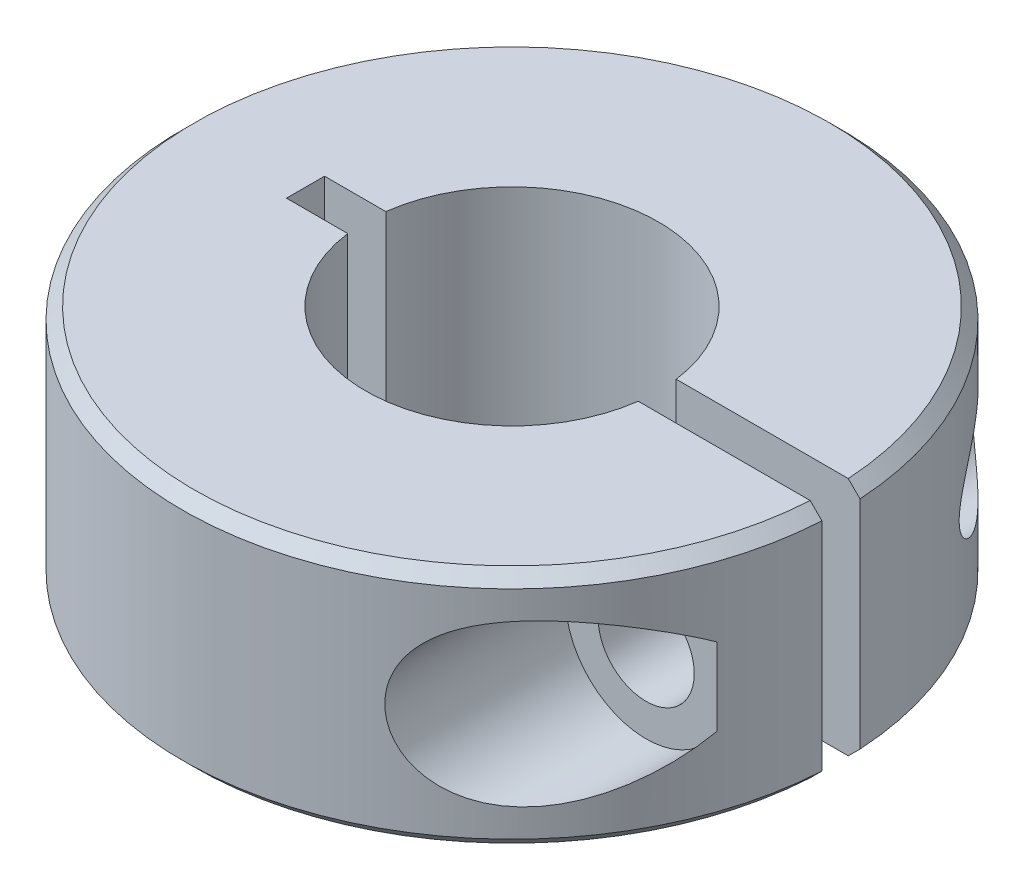
ISO-10303-21;
HEADER;
FILE_DESCRIPTION(('STEP AP214'),'2;1');
FILE_NAME('part.step','',(''),(''),'','','');
FILE_SCHEMA(('AUTOMOTIVE_DESIGN { 1 0 10303 214 1 1 1 1 }'));
ENDSEC;
DATA;
#1=APPLICATION_CONTEXT('core data for automotive mechanical design processes');
#2=APPLICATION_PROTOCOL_DEFINITION('international standard','automotive_design',2000,#1);
#3=PRODUCT_CONTEXT('',#1,'mechanical');
#4=PRODUCT('Part','Part','',(#3));
#5=PRODUCT_RELATED_PRODUCT_CATEGORY('part','',(#4));
#6=PRODUCT_DEFINITION_FORMATION('','',#4);
#7=PRODUCT_DEFINITION_CONTEXT('part definition',#1,'design');
#8=PRODUCT_DEFINITION('design','',#6,#7);
#9=PRODUCT_DEFINITION_SHAPE('','',#8);
#10=(LENGTH_UNIT() NAMED_UNIT(*) SI_UNIT(.MILLI.,.METRE.));
#11=(NAMED_UNIT(*) PLANE_ANGLE_UNIT() SI_UNIT($,.RADIAN.));
#12=(NAMED_UNIT(*) SI_UNIT($,.STERADIAN.) SOLID_ANGLE_UNIT());
#13=UNCERTAINTY_MEASURE_WITH_UNIT(LENGTH_MEASURE(1.E-05),#10,'distance_accuracy_value','');
#14=(GEOMETRIC_REPRESENTATION_CONTEXT(3) GLOBAL_UNCERTAINTY_ASSIGNED_CONTEXT((#13)) GLOBAL_UNIT_ASSIGNED_CONTEXT((#10,
#11,#12)) REPRESENTATION_CONTEXT('',''));
#15=CARTESIAN_POINT('',(0.,0.,0.));
#16=DIRECTION('',(0.,0.,1.));
#17=DIRECTION('',(1.,0.,0.));
#18=AXIS2_PLACEMENT_3D('',#15,#16,#17);
#19=CARTESIAN_POINT('',(10.4536322863428,5.207,4.6355));
#20=DIRECTION('',(0.,0.,1.));
#21=DIRECTION('',(1.,0.,0.));
#22=AXIS2_PLACEMENT_3D('',#19,#20,#21);
#23=PLANE('',#22);
#24=DIRECTION('',(0.,-1.,0.));
#25=VECTOR('',#24,1.);
#26=CARTESIAN_POINT('',(13.5146141639338,10.414,4.6355));
#27=LINE('',#26,#25);
#28=CARTESIAN_POINT('',(13.5146141639338,6.88864984317763,4.6355));
#29=VERTEX_POINT('',#28);
#30=CARTESIAN_POINT('',(13.5146141639338,3.52535015682237,4.6355));
#31=VERTEX_POINT('',#30);
#32=EDGE_CURVE('E131',#29,#31,#27,.T.);
#33=ORIENTED_EDGE('',*,*,#32,.F.);
#34=CARTESIAN_POINT('',(10.4536322863428,5.207,4.6355));
#35=DIRECTION('',(0.,0.,1.));
#36=DIRECTION('',(1.,0.,0.));
#37=AXIS2_PLACEMENT_3D('',#34,#35,#36);
#38=CIRCLE('',#37,3.4925);
#39=EDGE_CURVE('E106',#29,#31,#38,.T.);
#40=ORIENTED_EDGE('',*,*,#39,.T.);
#41=EDGE_LOOP('',(#33,#40));
#42=FACE_BOUND('',#41,.T.);
#43=CARTESIAN_POINT('',(10.4536322863428,5.207,4.6355));
#44=DIRECTION('',(0.,0.,1.));
#45=DIRECTION('',(1.,0.,0.));
#46=AXIS2_PLACEMENT_3D('',#43,#44,#45);
#47=CIRCLE('',#46,2.0828);
#48=CARTESIAN_POINT('',(12.5364322863428,5.207,4.6355));
#49=VERTEX_POINT('',#48);
#50=EDGE_CURVE('E216',#49,#49,#47,.F.);
#51=ORIENTED_EDGE('',*,*,#50,.T.);
#52=EDGE_LOOP('',(#51));
#53=FACE_BOUND('',#52,.T.);
#54=ADVANCED_FACE('F16',(#42,#53),#23,.T.);
#55=CARTESIAN_POINT('',(10.4536322863428,5.207,4.6355));
#56=DIRECTION('',(0.,0.,1.));
#57=DIRECTION('',(1.,0.,0.));
#58=AXIS2_PLACEMENT_3D('',#55,#56,#57);
#59=CYLINDRICAL_SURFACE('',#58,3.4925);
#60=CARTESIAN_POINT('',(13.5146141639338,3.52535015682237,4.6355));
#61=CARTESIAN_POINT('',(13.4734657813785,3.45053219058758,4.75549351409186));
#62=CARTESIAN_POINT('',(13.4302268169956,3.37825171797123,4.87632226470497));
#63=CARTESIAN_POINT('',(13.3395890388117,3.23828630950166,5.11905587048309));
#64=CARTESIAN_POINT('',(13.2921907963967,3.17060074467606,5.24096057577444));
#65=CARTESIAN_POINT('',(13.1931964607886,3.0392617366335,5.48540352856889));
#66=CARTESIAN_POINT('',(13.1415963377628,2.97561227080964,5.60794227615091));
#67=CARTESIAN_POINT('',(13.0342211969043,2.85225921923072,5.85317465900483));
#68=CARTESIAN_POINT('',(12.9784459805432,2.7925558213684,5.975868301369));
#69=CARTESIAN_POINT('',(12.8035198465617,2.61799180579304,6.3464707029259));
#70=CARTESIAN_POINT('',(12.6778580339151,2.50912338644716,6.59419094317968));
#71=CARTESIAN_POINT('',(12.4091250243239,2.30843324196439,7.08696054488827));
#72=CARTESIAN_POINT('',(12.2660619517979,2.21660361183348,7.33201109500072));
#73=CARTESIAN_POINT('',(12.0052477166712,2.07564708698722,7.74912543976716));
#74=CARTESIAN_POINT('',(11.8917557906811,2.02178401285684,7.92226024176632));
#75=CARTESIAN_POINT('',(11.6557500270132,1.92542766697286,8.26556218030146));
#76=CARTESIAN_POINT('',(11.533236381716,1.8829341528624,8.43572938002342));
#77=CARTESIAN_POINT('',(11.2798270313037,1.81108400396178,8.77167493314818));
#78=CARTESIAN_POINT('',(11.1489608381485,1.78168375770536,8.93746609965116));
#79=CARTESIAN_POINT('',(10.8789571050037,1.73779950539819,9.26422217701491));
#80=CARTESIAN_POINT('',(10.7398223363136,1.72331053117014,9.42518867800495));
#81=CARTESIAN_POINT('',(10.4950334102033,1.71325543423184,9.69587871504203));
#82=CARTESIAN_POINT('',(10.3911879203858,1.71346171942844,9.80708826330747));
#83=CARTESIAN_POINT('',(10.1802354802179,1.72361663070433,10.025893466123));
#84=CARTESIAN_POINT('',(10.0731293800066,1.73356273804458,10.1334900475539));
#85=CARTESIAN_POINT('',(9.85638583343249,1.76420771090556,10.3444260668589));
#86=CARTESIAN_POINT('',(9.74675006801209,1.78489962197864,10.4477682114819));
#87=CARTESIAN_POINT('',(9.52588108770916,1.83806226956346,10.649537619316));
#88=CARTESIAN_POINT('',(9.41464827420099,1.87053009461799,10.7479660905383));
#89=CARTESIAN_POINT('',(9.12987537167168,1.96989084403904,10.9922670682501));
#90=CARTESIAN_POINT('',(8.95596905107547,2.04589004994249,11.1342012865989));
#91=CARTESIAN_POINT('',(8.61362008254316,2.2321383236134,11.4011079576924));
#92=CARTESIAN_POINT('',(8.44517149773397,2.34234869391756,11.5260993467201));
#93=CARTESIAN_POINT('',(8.14767599480001,2.57828064385485,11.737799690831));
#94=CARTESIAN_POINT('',(8.01661550847026,2.69877572674256,11.8274363669922));
#95=CARTESIAN_POINT('',(7.83192228611212,2.89779565642393,11.949860104194));
#96=CARTESIAN_POINT('',(7.77231760901356,2.96721581323779,11.9886769770841));
#97=CARTESIAN_POINT('',(7.65782156389897,3.1118882979624,12.0621323672482));
#98=CARTESIAN_POINT('',(7.60292823971712,3.1871381804217,12.0967726211072));
#99=CARTESIAN_POINT('',(7.49830093292872,3.34354130070497,12.1619062932599));
#100=CARTESIAN_POINT('',(7.44859817410285,3.42472577073414,12.1923749239681));
#101=CARTESIAN_POINT('',(7.35545677608882,3.59206106144915,12.248790801792));
#102=CARTESIAN_POINT('',(7.31201529904221,3.67820960728044,12.2747400983654));
#103=CARTESIAN_POINT('',(7.23203185111771,3.85487230403631,12.3220344359941));
#104=CARTESIAN_POINT('',(7.1954901412556,3.9453866199539,12.3433793028699));
#105=CARTESIAN_POINT('',(7.12988497012144,4.13003344351378,12.3813907247671));
#106=CARTESIAN_POINT('',(7.10082078424802,4.22416559955636,12.3980577331056));
#107=CARTESIAN_POINT('',(7.05304880785853,4.40602638859494,12.4252903177215));
#108=CARTESIAN_POINT('',(7.03361378670217,4.49350010114398,12.4362885582186));
#109=CARTESIAN_POINT('',(7.00147942471002,4.67010564802743,12.4544081686503));
#110=CARTESIAN_POINT('',(6.98878242413213,4.75923804734818,12.46152819162));
#111=CARTESIAN_POINT('',(6.97031479326768,4.93838536632259,12.471867685147));
#112=CARTESIAN_POINT('',(6.96453936638425,5.02839963118782,12.4750898568995));
#113=CARTESIAN_POINT('',(6.95996641036833,5.20866928056879,12.4776407324856));
#114=CARTESIAN_POINT('',(6.96117140906697,5.29892474060111,12.4769680258616));
#115=CARTESIAN_POINT('',(6.97485547868691,5.56083018433861,12.4693320703588));
#116=CARTESIAN_POINT('',(6.99657860081275,5.73196791782358,12.4572112567843));
#117=CARTESIAN_POINT('',(7.0644773249253,6.0675472042355,12.4188280452145));
#118=CARTESIAN_POINT('',(7.11065080142872,6.23198933787686,12.3925668764449));
#119=CARTESIAN_POINT('',(7.22552964313838,6.55078228504552,12.3259394518561));
#120=CARTESIAN_POINT('',(7.29435329763117,6.70507490556951,12.2854990718149));
#121=CARTESIAN_POINT('',(7.45125033525368,6.99893413241851,12.1909753181492));
#122=CARTESIAN_POINT('',(7.53932609811345,7.13849891508802,12.1368902577947));
#123=CARTESIAN_POINT('',(7.73587713959669,7.40710864273126,12.0126194917526));
#124=CARTESIAN_POINT('',(7.84517521880329,7.53522876611185,11.9417426282886));
#125=CARTESIAN_POINT('',(8.07609541606501,7.77061030400829,11.7868006563529));
#126=CARTESIAN_POINT('',(8.19772180825944,7.87786444655456,11.7027309684464));
#127=CARTESIAN_POINT('',(8.46291690870689,8.08200903377094,11.5126526100139));
#128=CARTESIAN_POINT('',(8.60741421061004,8.17637242755249,11.4052394877601));
#129=CARTESIAN_POINT('',(8.90073714356776,8.33977919115744,11.1778351740133));
#130=CARTESIAN_POINT('',(9.04956534044457,8.40880720738168,11.0578364118865));
#131=CARTESIAN_POINT('',(9.31163071284513,8.50974549148681,10.8373506674988));
#132=CARTESIAN_POINT('',(9.42487253616357,8.54658399722366,10.7390552352876));
#133=CARTESIAN_POINT('',(9.65005912660641,8.60780034714005,10.5371663994815));
#134=CARTESIAN_POINT('',(9.76200335279959,8.63217316525478,10.433570877422));
#135=CARTESIAN_POINT('',(9.98362201141289,8.66955645983414,10.2217166794503));
#136=CARTESIAN_POINT('',(10.093292870003,8.68255020152385,10.1134513803896));
#137=CARTESIAN_POINT('',(10.3094354987476,8.69820429545875,9.89303007243206));
#138=CARTESIAN_POINT('',(10.4159063099263,8.7008615801624,9.78087291851424));
#139=CARTESIAN_POINT('',(10.6698032622963,8.69600237338331,9.50455735800215));
#140=CARTESIAN_POINT('',(10.815270275933,8.68364864047623,9.33867401080148));
#141=CARTESIAN_POINT('',(11.0974341583399,8.64260972440966,9.00155525234797));
#142=CARTESIAN_POINT('',(11.2341274201624,8.61391787178743,8.83031768241778));
#143=CARTESIAN_POINT('',(11.4986266568716,8.54232309834144,8.48304471939207));
#144=CARTESIAN_POINT('',(11.6263992430819,8.49936992483025,8.30699440987783));
#145=CARTESIAN_POINT('',(11.8722598647629,8.4011468117412,7.95165390832879));
#146=CARTESIAN_POINT('',(11.9903479213965,8.34587689907917,7.77236372337488));
#147=CARTESIAN_POINT('',(12.2568210675834,8.20305071244246,7.34752650723967));
#148=CARTESIAN_POINT('',(12.4011658342254,8.1109870683365,7.10095510570883));
#149=CARTESIAN_POINT('',(12.6722305711475,7.9095778855415,6.60508070707717));
#150=CARTESIAN_POINT('',(12.798942523566,7.8002245329705,6.35577652256779));
#151=CARTESIAN_POINT('',(12.9751973544264,7.62485137379911,5.98293566748013));
#152=CARTESIAN_POINT('',(13.031342202396,7.56490682767397,5.85959832088662));
#153=CARTESIAN_POINT('',(13.1394123453171,7.44103157637116,5.61307492527278));
#154=CARTESIAN_POINT('',(13.1913378451019,7.3771010649635,5.48988886919416));
#155=CARTESIAN_POINT('',(13.290938432216,7.24516098146888,5.24415362352607));
#156=CARTESIAN_POINT('',(13.3386176276605,7.17715546074122,5.12160392882291));
#157=CARTESIAN_POINT('',(13.4297737880896,7.03650466998009,4.8775883402019));
#158=CARTESIAN_POINT('',(13.4732501710035,6.96385875958078,4.75612259851508));
#159=CARTESIAN_POINT('',(13.5146141639338,6.88864984317763,4.6355));
#160=B_SPLINE_CURVE_WITH_KNOTS('',3,(#60,#61,#62,#63,#64,#65,#66,#67,#68,#69,#70,#71,#72,#73,
#74,#75,#76,#77,#78,#79,#80,#81,#82,#83,#84,#85,#86,#87,#88,#89,#90,#91,#92,#93,#94,#95,#96,#97,
#98,#99,#100,#101,#102,#103,#104,#105,#106,#107,#108,#109,#110,#111,#112,#113,#114,#115,#116,
#117,#118,#119,#120,#121,#122,#123,#124,#125,#126,#127,#128,#129,#130,#131,#132,#133,#134,#135,
#136,#137,#138,#139,#140,#141,#142,#143,#144,#145,#146,#147,#148,#149,#150,#151,#152,#153,#154,
#155,#156,#157,#158,#159),.UNSPECIFIED.,.F.,.F.,(4,2,2,2,2,2,2,2,2,2,2,2,2,2,2,2,2,2,2,2,2,2,2,
2,2,2,2,2,2,2,2,2,2,2,2,2,2,2,2,2,2,2,2,2,2,2,2,2,2,4),(0.,0.441744010800502,0.883427431187499,
1.32553955498952,1.76767271489679,2.66168998310212,3.55529143718905,4.19657085490573,
4.83783660183374,5.47695012656619,6.11585064074666,6.57197774202862,7.02798691899797,
7.48370134396361,7.93930317557769,8.64740459762837,9.35470796180666,9.94991443244466,
10.2477752709386,10.5455118324503,10.8449471417357,11.1442463055178,11.4435567894148,
11.7428382580197,12.0133339889288,12.2839236073735,12.5543256006821,12.8248255211573,
13.3409593665076,13.8570483514111,14.3758765248121,14.8947688662449,15.4406520416796,
15.9867251225178,16.5942899710242,17.202222406901,17.6648523064335,18.127668587861,
18.5911643780392,19.054797708979,19.7167205885678,20.3789138687953,21.0434657349404,
21.7080161488521,22.6074073385579,23.5072061656266,23.9516581501891,24.3960885453975,
24.8400841936527,25.2841412454728),.UNSPECIFIED.);
#161=EDGE_CURVE('E100',#31,#29,#160,.T.);
#162=ORIENTED_EDGE('',*,*,#161,.F.);
#163=ORIENTED_EDGE('',*,*,#39,.F.);
#164=EDGE_LOOP('',(#162,#163));
#165=FACE_BOUND('',#164,.T.);
#166=ADVANCED_FACE('F198',(#165),#59,.F.);
#167=CARTESIAN_POINT('',(0.,9.906,0.));
#168=DIRECTION('',(0.,-1.,0.));
#169=DIRECTION('',(0.,0.,-1.));
#170=AXIS2_PLACEMENT_3D('',#167,#168,#169);
#171=CONICAL_SURFACE('',#170,14.2875,0.785398163397447);
#172=CARTESIAN_POINT('',(0.,9.906,0.));
#173=DIRECTION('',(0.,-1.,0.));
#174=DIRECTION('',(0.,0.,-1.));
#175=AXIS2_PLACEMENT_3D('',#172,#173,#174);
#176=CIRCLE('',#175,14.2875);
#177=CARTESIAN_POINT('',(14.2636322863428,9.906,0.825500000000003));
#178=VERTEX_POINT('',#177);
#179=CARTESIAN_POINT('',(14.2636322863428,9.906,-0.825499999999997));
#180=VERTEX_POINT('',#179);
#181=EDGE_CURVE('E91',#178,#180,#176,.T.);
#182=ORIENTED_EDGE('',*,*,#181,.F.);
#183=CARTESIAN_POINT('',(14.2636322863428,9.906,0.825500000000003));
#184=CARTESIAN_POINT('',(14.1788213692304,9.99066933262399,0.825500000000003));
#185=CARTESIAN_POINT('',(14.0940091214481,10.0753373322691,0.825500000000003));
#186=CARTESIAN_POINT('',(13.9243819645429,10.2446706656025,0.825500000000003));
#187=CARTESIAN_POINT('',(13.8395670554201,10.3293359992907,0.825500000000003));
#188=CARTESIAN_POINT('',(13.7547508156273,10.414,0.825500000000003));
#189=B_SPLINE_CURVE_WITH_KNOTS('',3,(#183,#184,#185,#186,#187,#188),.UNSPECIFIED.,.F.,.F.,(4,2,
4),(0.,0.359522026919291,0.719044053841794),.UNSPECIFIED.);
#190=CARTESIAN_POINT('',(13.7547508156273,10.414,0.825500000000003));
#191=VERTEX_POINT('',#190);
#192=EDGE_CURVE('E138',#178,#191,#189,.T.);
#193=ORIENTED_EDGE('',*,*,#192,.T.);
#194=CARTESIAN_POINT('',(0.,10.414,0.));
#195=DIRECTION('',(0.,-1.,0.));
#196=DIRECTION('',(0.,0.,-1.));
#197=AXIS2_PLACEMENT_3D('',#194,#195,#196);
#198=CIRCLE('',#197,13.7795);
#199=CARTESIAN_POINT('',(13.7547508156273,10.414,-0.825499999999997));
#200=VERTEX_POINT('',#199);
#201=EDGE_CURVE('E84',#200,#191,#198,.F.);
#202=ORIENTED_EDGE('',*,*,#201,.F.);
#203=CARTESIAN_POINT('',(13.7547508156273,10.414,-0.825499999999997));
#204=CARTESIAN_POINT('',(13.8395670554201,10.3293359992907,-0.825499999999997));
#205=CARTESIAN_POINT('',(13.9243819645429,10.2446706656025,-0.825499999999997));
#206=CARTESIAN_POINT('',(14.0940091214481,10.0753373322691,-0.825499999999997));
#207=CARTESIAN_POINT('',(14.1788213692304,9.99066933262399,-0.825499999999997));
#208=CARTESIAN_POINT('',(14.2636322863428,9.906,-0.825499999999997));
#209=B_SPLINE_CURVE_WITH_KNOTS('',3,(#203,#204,#205,#206,#207,#208),.UNSPECIFIED.,.F.,.F.,(4,2,
4),(0.,0.359522026922503,0.719044053841793),.UNSPECIFIED.);
#210=EDGE_CURVE('E19',#200,#180,#209,.T.);
#211=ORIENTED_EDGE('',*,*,#210,.T.);
#212=EDGE_LOOP('',(#182,#193,#202,#211));
#213=FACE_BOUND('',#212,.T.);
#214=ADVANCED_FACE('F102',(#213),#171,.T.);
#215=CARTESIAN_POINT('',(-8.9535,0.,-0.825499999999997));
#216=DIRECTION('',(-1.,0.,0.));
#217=DIRECTION('',(0.,0.,1.));
#218=AXIS2_PLACEMENT_3D('',#215,#216,#217);
#219=PLANE('',#218);
#220=DIRECTION('',(0.,1.,0.));
#221=VECTOR('',#220,1.);
#222=CARTESIAN_POINT('',(-8.9535,0.,0.825500000000003));
#223=LINE('',#222,#221);
#224=CARTESIAN_POINT('',(-8.9535,10.414,0.825500000000003));
#225=VERTEX_POINT('',#224);
#226=CARTESIAN_POINT('',(-8.9535,0.,0.825500000000003));
#227=VERTEX_POINT('',#226);
#228=EDGE_CURVE('E144',#225,#227,#223,.F.);
#229=ORIENTED_EDGE('',*,*,#228,.T.);
#230=DIRECTION('',(0.,0.,1.));
#231=VECTOR('',#230,1.);
#232=CARTESIAN_POINT('',(-8.9535,0.,-0.825499999999997));
#233=LINE('',#232,#231);
#234=CARTESIAN_POINT('',(-8.9535,0.,-0.825499999999997));
#235=VERTEX_POINT('',#234);
#236=EDGE_CURVE('E134',#235,#227,#233,.T.);
#237=ORIENTED_EDGE('',*,*,#236,.F.);
#238=DIRECTION('',(0.,1.,0.));
#239=VECTOR('',#238,1.);
#240=CARTESIAN_POINT('',(-8.9535,0.,-0.825499999999997));
#241=LINE('',#240,#239);
#242=CARTESIAN_POINT('',(-8.9535,10.414,-0.825499999999997));
#243=VERTEX_POINT('',#242);
#244=EDGE_CURVE('E125',#235,#243,#241,.T.);
#245=ORIENTED_EDGE('',*,*,#244,.T.);
#246=DIRECTION('',(0.,0.,1.));
#247=VECTOR('',#246,1.);
#248=CARTESIAN_POINT('',(-8.9535,10.414,0.));
#249=LINE('',#248,#247);
#250=EDGE_CURVE('E128',#225,#243,#249,.F.);
#251=ORIENTED_EDGE('',*,*,#250,.F.);
#252=EDGE_LOOP('',(#229,#237,#245,#251));
#253=FACE_BOUND('',#252,.T.);
#254=ADVANCED_FACE('F226',(#253),#219,.F.);
#255=CARTESIAN_POINT('',(10.4536322863428,5.207,-23.8125));
#256=DIRECTION('',(0.,0.,1.));
#257=DIRECTION('',(1.,0.,0.));
#258=AXIS2_PLACEMENT_3D('',#255,#256,#257);
#259=CYLINDRICAL_SURFACE('',#258,2.0828);
#260=CARTESIAN_POINT('',(10.4536322863428,5.207,-0.825499999999996));
#261=DIRECTION('',(0.,0.,1.));
#262=DIRECTION('',(1.,0.,0.));
#263=AXIS2_PLACEMENT_3D('',#260,#261,#262);
#264=CIRCLE('',#263,2.0828);
#265=CARTESIAN_POINT('',(12.5364322863428,5.207,-0.825499999999996));
#266=VERTEX_POINT('',#265);
#267=EDGE_CURVE('E183',#266,#266,#264,.T.);
#268=ORIENTED_EDGE('',*,*,#267,.T.);
#269=EDGE_LOOP('',(#268));
#270=FACE_BOUND('',#269,.T.);
#271=CARTESIAN_POINT('',(8.37083228634278,5.207,-11.5785069453674));
#272=CARTESIAN_POINT('',(8.37083992321464,5.10722026734939,-11.5785027948659));
#273=CARTESIAN_POINT('',(8.37805006458452,5.00736084112323,-11.5732993601378));
#274=CARTESIAN_POINT('',(8.40646558473121,4.81068216838004,-11.5526743356489));
#275=CARTESIAN_POINT('',(8.42768758095025,4.71386667483173,-11.5372406131321));
#276=CARTESIAN_POINT('',(8.48275190200082,4.52641586181302,-11.4968137757952));
#277=CARTESIAN_POINT('',(8.51654958261779,4.43576000592412,-11.4718544692471));
#278=CARTESIAN_POINT('',(8.59493926629222,4.26234080868377,-11.4132405573571));
#279=CARTESIAN_POINT('',(8.63953100023651,4.17957727063578,-11.3795861687963));
#280=CARTESIAN_POINT('',(8.74003708637884,4.0191112745853,-11.3025928911207));
#281=CARTESIAN_POINT('',(8.79642659623595,3.94191020202831,-11.2588349645784));
#282=CARTESIAN_POINT('',(8.91646839229515,3.79847308306983,-11.1640099965132));
#283=CARTESIAN_POINT('',(8.98012460276749,3.73224300915826,-11.1129390018569));
#284=CARTESIAN_POINT('',(9.14219176360373,3.58371019437211,-10.9803557395842));
#285=CARTESIAN_POINT('',(9.24340867225347,3.50747643131859,-10.8954477617019));
#286=CARTESIAN_POINT('',(9.45118364029093,3.37717447081319,-10.7157262865252));
#287=CARTESIAN_POINT('',(9.55775193783372,3.32315073066023,-10.6208933939341));
#288=CARTESIAN_POINT('',(9.80900359066056,3.22036769197991,-10.3900990613777));
#289=CARTESIAN_POINT('',(9.95425766364662,3.17972763815165,-10.2511636774331));
#290=CARTESIAN_POINT('',(10.2413018572967,3.12992108248867,-9.964424395616));
#291=CARTESIAN_POINT('',(10.3830868013125,3.12079906929713,-9.81660826126878));
#292=CARTESIAN_POINT('',(10.6117214781662,3.12824377830954,-9.56775581345591));
#293=CARTESIAN_POINT('',(10.7006013277489,3.13701266098545,-9.46823418878775));
#294=CARTESIAN_POINT('',(10.8748445868078,3.16532623213195,-9.26758067403906));
#295=CARTESIAN_POINT('',(10.9602066808226,3.18487491309638,-9.16644820083656));
#296=CARTESIAN_POINT('',(11.1270411179947,3.23414536599073,-8.96319905868907));
#297=CARTESIAN_POINT('',(11.2085069853206,3.26388344666178,-8.86108106858953));
#298=CARTESIAN_POINT('',(11.3670271228449,3.33316749447469,-8.65679222526301));
#299=CARTESIAN_POINT('',(11.4440827813216,3.37271035406197,-8.55462139900114));
#300=CARTESIAN_POINT('',(11.5780551317187,3.45243804331258,-8.37205761799897));
#301=CARTESIAN_POINT('',(11.635850493131,3.49081255178422,-8.29151418438075));
#302=CARTESIAN_POINT('',(11.7482380036105,3.5739238558317,-8.13148889607971));
#303=CARTESIAN_POINT('',(11.8028307594663,3.61865944065713,-8.05200684251874));
#304=CARTESIAN_POINT('',(11.9083422123707,3.71470408200634,-7.8951214707489));
#305=CARTESIAN_POINT('',(11.9592740965991,3.76598748349517,-7.8177113946988));
#306=CARTESIAN_POINT('',(12.0572504624474,3.87587873393593,-7.6657369661134));
#307=CARTESIAN_POINT('',(12.1042980035919,3.93448072514727,-7.59117039927348));
#308=CARTESIAN_POINT('',(12.1881368341907,4.05198073100936,-7.45570147332415));
#309=CARTESIAN_POINT('',(12.2254697261338,4.10987756144764,-7.39427291646235));
#310=CARTESIAN_POINT('',(12.2960479357775,4.23303625440596,-7.27630296011884));
#311=CARTESIAN_POINT('',(12.3292867252746,4.29830956924309,-7.21976940747026));
#312=CARTESIAN_POINT('',(12.3908316008589,4.43808173002392,-7.11363128102298));
#313=CARTESIAN_POINT('',(12.4190671475271,4.51269050959131,-7.06412749289363));
#314=CARTESIAN_POINT('',(12.4679697322498,4.67101022730007,-6.97745433589816));
#315=CARTESIAN_POINT('',(12.4886668850158,4.75468317659136,-6.94023594593323));
#316=CARTESIAN_POINT('',(12.5146204200119,4.90056994888516,-6.8932868488459));
#317=CARTESIAN_POINT('',(12.5227241026694,4.96063855362414,-6.87852885881559));
#318=CARTESIAN_POINT('',(12.5336262772715,5.08280731285208,-6.85864445375517));
#319=CARTESIAN_POINT('',(12.5364319085039,5.14490461857504,-6.85350507742975));
#320=CARTESIAN_POINT('',(12.5364326599302,5.26839667674135,-6.85350361689546));
#321=CARTESIAN_POINT('',(12.533690555046,5.32979147224593,-6.85852654205984));
#322=CARTESIAN_POINT('',(12.5230277189178,5.4506200035854,-6.8779757174078));
#323=CARTESIAN_POINT('',(12.5151006786578,5.51005125751747,-6.89241342340719));
#324=CARTESIAN_POINT('',(12.4920698529185,5.64099797813774,-6.93408551433065));
#325=CARTESIAN_POINT('',(12.4756147527584,5.71150156887528,-6.96370776809931));
#326=CARTESIAN_POINT('',(12.437162374589,5.84621720449739,-7.03215450724412));
#327=CARTESIAN_POINT('',(12.4151529634007,5.9104150425669,-7.07099912737925));
#328=CARTESIAN_POINT('',(12.3512323662783,6.0724253630074,-7.18234123733796));
#329=CARTESIAN_POINT('',(12.3056802502509,6.16498526278457,-7.26030849854926));
#330=CARTESIAN_POINT('',(12.2065634585214,6.33620156183093,-7.42575747975777));
#331=CARTESIAN_POINT('',(12.1529759664175,6.41481693133752,-7.51326609279021));
#332=CARTESIAN_POINT('',(12.0454410060845,6.55273682418439,-7.68434421980933));
#333=CARTESIAN_POINT('',(11.9921081890788,6.61319875346168,-7.76737986687158));
#334=CARTESIAN_POINT('',(11.8810664656063,6.72579710113708,-7.93619160341991));
#335=CARTESIAN_POINT('',(11.8233543506295,6.77792732670578,-8.02196967500298));
#336=CARTESIAN_POINT('',(11.7039601891243,6.87452315568082,-8.19518468593394));
#337=CARTESIAN_POINT('',(11.6422744612564,6.91898150707744,-8.28262310905603));
#338=CARTESIAN_POINT('',(11.5152691528827,7.00050955670839,-8.45830872766602));
#339=CARTESIAN_POINT('',(11.4499491017491,7.03757829516088,-8.54655602665787));
#340=CARTESIAN_POINT('',(11.3118632932747,7.10642118926707,-8.72858698858593));
#341=CARTESIAN_POINT('',(11.2388861359938,7.13773982408734,-8.82238284774289));
#342=CARTESIAN_POINT('',(11.089376714954,7.19199602675404,-9.00959132957644));
#343=CARTESIAN_POINT('',(11.012843884877,7.21493225432681,-9.10300388860784));
#344=CARTESIAN_POINT('',(10.8566337349726,7.2520135187338,-9.2887489829471));
#345=CARTESIAN_POINT('',(10.7769606645458,7.26617002948529,-9.38108277247634));
#346=CARTESIAN_POINT('',(10.614782170136,7.285160531911,-9.56420591618958));
#347=CARTESIAN_POINT('',(10.5322765998066,7.28999404115488,-9.65499519020977));
#348=CARTESIAN_POINT('',(10.3161923018508,7.28947725344657,-9.88667788192103));
#349=CARTESIAN_POINT('',(10.1808204740609,7.27656808177274,-10.0259981187358));
#350=CARTESIAN_POINT('',(9.90748057063845,7.2217338414323,-10.2961766290579));
#351=CARTESIAN_POINT('',(9.7695159601513,7.17984514512129,-10.4270452853221));
#352=CARTESIAN_POINT('',(9.52919525231592,7.07681715061922,-10.6464517900281));
#353=CARTESIAN_POINT('',(9.42623899335369,7.02270965433885,-10.7376115865962));
#354=CARTESIAN_POINT('',(9.22563273893706,6.89349345441485,-10.9104438950733));
#355=CARTESIAN_POINT('',(9.12797541395193,6.81841469102893,-10.9921296992304));
#356=CARTESIAN_POINT('',(8.96109360218021,6.66325790503897,-11.128375010651));
#357=CARTESIAN_POINT('',(8.89005264020706,6.58706053233099,-11.1851108583714));
#358=CARTESIAN_POINT('',(8.75772649441796,6.42077408829729,-11.2890190831904));
#359=CARTESIAN_POINT('',(8.69644148551136,6.33068476796715,-11.3361912888316));
#360=CARTESIAN_POINT('',(8.58666833901233,6.13702548324506,-11.4195715155544));
#361=CARTESIAN_POINT('',(8.53829481161265,6.03334622725096,-11.4556817349973));
#362=CARTESIAN_POINT('',(8.47855049896788,5.87067412498869,-11.4998889509456));
#363=CARTESIAN_POINT('',(8.46077622908864,5.81528123512851,-11.5129617961332));
#364=CARTESIAN_POINT('',(8.42980214257314,5.70255540623668,-11.5356604462481));
#365=CARTESIAN_POINT('',(8.41659995143472,5.6452234912687,-11.5452880405481));
#366=CARTESIAN_POINT('',(8.39426198822099,5.52490310687236,-11.561540977196));
#367=CARTESIAN_POINT('',(8.38549596247025,5.46180839149423,-11.5678939794315));
#368=CARTESIAN_POINT('',(8.37377886989556,5.33481998347192,-11.5763781444305));
#369=CARTESIAN_POINT('',(8.37082739359241,5.27092634740922,-11.5785096044886));
#370=CARTESIAN_POINT('',(8.37083228634278,5.207,-11.5785069453674));
#371=B_SPLINE_CURVE_WITH_KNOTS('',3,(#271,#272,#273,#274,#275,#276,#277,#278,#279,#280,#281,
#282,#283,#284,#285,#286,#287,#288,#289,#290,#291,#292,#293,#294,#295,#296,#297,#298,#299,#300,
#301,#302,#303,#304,#305,#306,#307,#308,#309,#310,#311,#312,#313,#314,#315,#316,#317,#318,#319,
#320,#321,#322,#323,#324,#325,#326,#327,#328,#329,#330,#331,#332,#333,#334,#335,#336,#337,#338,
#339,#340,#341,#342,#343,#344,#345,#346,#347,#348,#349,#350,#351,#352,#353,#354,#355,#356,#357,
#358,#359,#360,#361,#362,#363,#364,#365,#366,#367,#368,#369,#370),.UNSPECIFIED.,.T.,.F.,(4,2,2,
2,2,2,2,2,2,2,2,2,2,2,2,2,2,2,2,2,2,2,2,2,2,2,2,2,2,2,2,2,2,2,2,2,2,2,2,2,2,2,2,2,2,2,2,2,2,4),
(0.,0.299091572587819,0.598538493270372,0.896932352514327,1.19531877308343,1.50953402238708,
1.82391976879804,2.27898229392397,2.73495132368661,3.34686146914422,3.95963499173202,
4.36033865284032,4.76119082159278,5.16268759858267,5.56405728633376,5.88274399909707,
6.20137013487024,6.5187841151546,6.83594564878574,7.11244508211984,7.38937984853853,
7.66995280803116,7.94939229917493,8.13567498710315,8.32170647373706,8.50564471175847,
8.68980718276278,8.92315570609398,9.15701845070607,9.54279111409384,9.92968067969225,
10.2764141240686,10.6234041034955,10.9707203072605,11.318081591994,11.6864411018379,
12.0548594834071,12.4227953711537,12.7907502976908,13.3727310222076,13.9539826216621,
14.3957505476968,14.8368909661265,15.1913557884342,15.5458269650398,15.9033472197397,
16.0819659515557,16.2604917783965,16.4521256692805,16.6437460642095),.UNSPECIFIED.);
#372=CARTESIAN_POINT('',(8.37083228634278,5.207,-11.5785069453674));
#373=VERTEX_POINT('',#372);
#374=EDGE_CURVE('E137',#373,#373,#371,.T.);
#375=ORIENTED_EDGE('',*,*,#374,.F.);
#376=EDGE_LOOP('',(#375));
#377=FACE_BOUND('',#376,.T.);
#378=ADVANCED_FACE('F221',(#270,#377),#259,.F.);
#379=CARTESIAN_POINT('',(10.4536322863428,5.207,-23.8125));
#380=DIRECTION('',(0.,0.,1.));
#381=DIRECTION('',(1.,0.,0.));
#382=AXIS2_PLACEMENT_3D('',#379,#380,#381);
#383=CYLINDRICAL_SURFACE('',#382,2.0828);
#384=CARTESIAN_POINT('',(10.4536322863428,5.207,0.825500000000003));
#385=DIRECTION('',(0.,0.,1.));
#386=DIRECTION('',(1.,0.,0.));
#387=AXIS2_PLACEMENT_3D('',#384,#385,#386);
#388=CIRCLE('',#387,2.0828);
#389=CARTESIAN_POINT('',(12.5364322863428,5.207,0.825500000000003));
#390=VERTEX_POINT('',#389);
#391=EDGE_CURVE('E168',#390,#390,#388,.F.);
#392=ORIENTED_EDGE('',*,*,#391,.T.);
#393=EDGE_LOOP('',(#392));
#394=FACE_BOUND('',#393,.T.);
#395=ORIENTED_EDGE('',*,*,#50,.F.);
#396=EDGE_LOOP('',(#395));
#397=FACE_BOUND('',#396,.T.);
#398=ADVANCED_FACE('F225',(#394,#397),#383,.F.);
#399=CARTESIAN_POINT('',(0.,10.414,0.));
#400=DIRECTION('',(0.,1.,0.));
#401=DIRECTION('',(0.,0.,1.));
#402=AXIS2_PLACEMENT_3D('',#399,#400,#401);
#403=PLANE('',#402);
#404=DIRECTION('',(-1.,0.,0.));
#405=VECTOR('',#404,1.);
#406=CARTESIAN_POINT('',(-8.9535,10.414,-0.825499999999997));
#407=LINE('',#406,#405);
#408=CARTESIAN_POINT('',(-6.29611386094629,10.414,-0.825499999999997));
#409=VERTEX_POINT('',#408);
#410=EDGE_CURVE('E121',#243,#409,#407,.F.);
#411=ORIENTED_EDGE('',*,*,#410,.T.);
#412=CARTESIAN_POINT('',(0.,10.414,0.));
#413=DIRECTION('',(0.,-1.,0.));
#414=DIRECTION('',(0.,0.,-1.));
#415=AXIS2_PLACEMENT_3D('',#412,#413,#414);
#416=CIRCLE('',#415,6.35);
#417=CARTESIAN_POINT('',(6.29611386094629,10.414,-0.825499999999997));
#418=VERTEX_POINT('',#417);
#419=EDGE_CURVE('E186',#409,#418,#416,.T.);
#420=ORIENTED_EDGE('',*,*,#419,.T.);
#421=DIRECTION('',(-1.,0.,0.));
#422=VECTOR('',#421,1.);
#423=CARTESIAN_POINT('',(-8.9535,10.414,-0.825499999999997));
#424=LINE('',#423,#422);
#425=EDGE_CURVE('E111',#418,#200,#424,.F.);
#426=ORIENTED_EDGE('',*,*,#425,.T.);
#427=ORIENTED_EDGE('',*,*,#201,.T.);
#428=DIRECTION('',(1.,0.,0.));
#429=VECTOR('',#428,1.);
#430=CARTESIAN_POINT('',(15.6581449899759,10.414,0.825500000000003));
#431=LINE('',#430,#429);
#432=CARTESIAN_POINT('',(6.29611386094629,10.414,0.825500000000003));
#433=VERTEX_POINT('',#432);
#434=EDGE_CURVE('E118',#191,#433,#431,.F.);
#435=ORIENTED_EDGE('',*,*,#434,.T.);
#436=CARTESIAN_POINT('',(0.,10.414,0.));
#437=DIRECTION('',(0.,-1.,0.));
#438=DIRECTION('',(0.,0.,-1.));
#439=AXIS2_PLACEMENT_3D('',#436,#437,#438);
#440=CIRCLE('',#439,6.35);
#441=CARTESIAN_POINT('',(-6.29611386094629,10.414,0.825500000000003));
#442=VERTEX_POINT('',#441);
#443=EDGE_CURVE('E99',#433,#442,#440,.T.);
#444=ORIENTED_EDGE('',*,*,#443,.T.);
#445=DIRECTION('',(1.,0.,0.));
#446=VECTOR('',#445,1.);
#447=CARTESIAN_POINT('',(15.6581449899759,10.414,0.825500000000003));
#448=LINE('',#447,#446);
#449=EDGE_CURVE('E141',#442,#225,#448,.F.);
#450=ORIENTED_EDGE('',*,*,#449,.T.);
#451=ORIENTED_EDGE('',*,*,#250,.T.);
#452=EDGE_LOOP('',(#411,#420,#426,#427,#435,#444,#450,#451));
#453=FACE_BOUND('',#452,.T.);
#454=ADVANCED_FACE('F205',(#453),#403,.T.);
#455=CARTESIAN_POINT('',(0.,10.414,0.));
#456=DIRECTION('',(0.,-1.,0.));
#457=DIRECTION('',(0.,0.,-1.));
#458=AXIS2_PLACEMENT_3D('',#455,#456,#457);
#459=CYLINDRICAL_SURFACE('',#458,14.2875);
#460=CARTESIAN_POINT('',(0.,0.508000000000002,0.));
#461=DIRECTION('',(0.,1.,0.));
#462=DIRECTION('',(0.,0.,1.));
#463=AXIS2_PLACEMENT_3D('',#460,#461,#462);
#464=CIRCLE('',#463,14.2875);
#465=CARTESIAN_POINT('',(14.2636322863428,0.508000000000001,0.825500000000003));
#466=VERTEX_POINT('',#465);
#467=CARTESIAN_POINT('',(14.2636322863428,0.508000000000001,-0.825499999999997));
#468=VERTEX_POINT('',#467);
#469=EDGE_CURVE('E113',#466,#468,#464,.F.);
#470=ORIENTED_EDGE('',*,*,#469,.F.);
#471=DIRECTION('',(0.,1.,0.));
#472=VECTOR('',#471,1.);
#473=CARTESIAN_POINT('',(14.2636322863428,0.,0.825500000000003));
#474=LINE('',#473,#472);
#475=EDGE_CURVE('E98',#466,#178,#474,.T.);
#476=ORIENTED_EDGE('',*,*,#475,.T.);
#477=ORIENTED_EDGE('',*,*,#181,.T.);
#478=DIRECTION('',(0.,1.,0.));
#479=VECTOR('',#478,1.);
#480=CARTESIAN_POINT('',(14.2636322863428,0.,-0.825499999999997));
#481=LINE('',#480,#479);
#482=EDGE_CURVE('E95',#180,#468,#481,.F.);
#483=ORIENTED_EDGE('',*,*,#482,.T.);
#484=EDGE_LOOP('',(#470,#476,#477,#483));
#485=FACE_BOUND('',#484,.T.);
#486=ORIENTED_EDGE('',*,*,#32,.T.);
#487=ORIENTED_EDGE('',*,*,#161,.T.);
#488=EDGE_LOOP('',(#486,#487));
#489=FACE_BOUND('',#488,.T.);
#490=ORIENTED_EDGE('',*,*,#374,.T.);
#491=EDGE_LOOP('',(#490));
#492=FACE_BOUND('',#491,.T.);
#493=ADVANCED_FACE('F92',(#485,#489,#492),#459,.T.);
#494=CARTESIAN_POINT('',(0.,10.414,0.));
#495=DIRECTION('',(0.,-1.,0.));
#496=DIRECTION('',(0.,0.,-1.));
#497=AXIS2_PLACEMENT_3D('',#494,#495,#496);
#498=CYLINDRICAL_SURFACE('',#497,6.35);
#499=ORIENTED_EDGE('',*,*,#443,.F.);
#500=DIRECTION('',(0.,1.,0.));
#501=VECTOR('',#500,1.);
#502=CARTESIAN_POINT('',(6.29611386094629,0.,0.825500000000003));
#503=LINE('',#502,#501);
#504=CARTESIAN_POINT('',(6.29611386094629,0.,0.825500000000003));
#505=VERTEX_POINT('',#504);
#506=EDGE_CURVE('E167',#433,#505,#503,.F.);
#507=ORIENTED_EDGE('',*,*,#506,.T.);
#508=CARTESIAN_POINT('',(0.,0.,0.));
#509=DIRECTION('',(0.,-1.,0.));
#510=DIRECTION('',(0.,0.,-1.));
#511=AXIS2_PLACEMENT_3D('',#508,#509,#510);
#512=CIRCLE('',#511,6.35);
#513=CARTESIAN_POINT('',(-6.29611386094629,0.,0.825500000000003));
#514=VERTEX_POINT('',#513);
#515=EDGE_CURVE('E155',#505,#514,#512,.T.);
#516=ORIENTED_EDGE('',*,*,#515,.T.);
#517=DIRECTION('',(0.,1.,0.));
#518=VECTOR('',#517,1.);
#519=CARTESIAN_POINT('',(-6.29611386094629,0.,0.825500000000003));
#520=LINE('',#519,#518);
#521=EDGE_CURVE('E278',#514,#442,#520,.T.);
#522=ORIENTED_EDGE('',*,*,#521,.T.);
#523=EDGE_LOOP('',(#499,#507,#516,#522));
#524=FACE_BOUND('',#523,.T.);
#525=ADVANCED_FACE('F204',(#524),#498,.F.);
#526=CARTESIAN_POINT('',(15.6581449899759,0.,0.825500000000003));
#527=DIRECTION('',(0.,0.,1.));
#528=DIRECTION('',(1.,0.,0.));
#529=AXIS2_PLACEMENT_3D('',#526,#527,#528);
#530=PLANE('',#529);
#531=DIRECTION('',(1.,0.,0.));
#532=VECTOR('',#531,1.);
#533=CARTESIAN_POINT('',(0.,0.,0.825500000000003));
#534=LINE('',#533,#532);
#535=EDGE_CURVE('E158',#514,#227,#534,.F.);
#536=ORIENTED_EDGE('',*,*,#535,.T.);
#537=ORIENTED_EDGE('',*,*,#228,.F.);
#538=ORIENTED_EDGE('',*,*,#449,.F.);
#539=ORIENTED_EDGE('',*,*,#521,.F.);
#540=EDGE_LOOP('',(#536,#537,#538,#539));
#541=FACE_BOUND('',#540,.T.);
#542=ADVANCED_FACE('F312',(#541),#530,.F.);
#543=CARTESIAN_POINT('',(-8.9535,0.,-0.825499999999997));
#544=DIRECTION('',(0.,0.,-1.));
#545=DIRECTION('',(-1.,0.,0.));
#546=AXIS2_PLACEMENT_3D('',#543,#544,#545);
#547=PLANE('',#546);
#548=ORIENTED_EDGE('',*,*,#410,.F.);
#549=ORIENTED_EDGE('',*,*,#244,.F.);
#550=DIRECTION('',(1.,0.,0.));
#551=VECTOR('',#550,1.);
#552=CARTESIAN_POINT('',(0.,0.,-0.825499999999997));
#553=LINE('',#552,#551);
#554=CARTESIAN_POINT('',(-6.29611386094629,0.,-0.825499999999997));
#555=VERTEX_POINT('',#554);
#556=EDGE_CURVE('E154',#235,#555,#553,.T.);
#557=ORIENTED_EDGE('',*,*,#556,.T.);
#558=DIRECTION('',(0.,-1.,0.));
#559=VECTOR('',#558,1.);
#560=CARTESIAN_POINT('',(-6.29611386094629,10.414,-0.825499999999996));
#561=LINE('',#560,#559);
#562=EDGE_CURVE('E124',#555,#409,#561,.F.);
#563=ORIENTED_EDGE('',*,*,#562,.T.);
#564=EDGE_LOOP('',(#548,#549,#557,#563));
#565=FACE_BOUND('',#564,.T.);
#566=ADVANCED_FACE('F275',(#565),#547,.F.);
#567=CARTESIAN_POINT('',(0.,10.414,0.));
#568=DIRECTION('',(0.,-1.,0.));
#569=DIRECTION('',(0.,0.,-1.));
#570=AXIS2_PLACEMENT_3D('',#567,#568,#569);
#571=CYLINDRICAL_SURFACE('',#570,6.35);
#572=ORIENTED_EDGE('',*,*,#419,.F.);
#573=ORIENTED_EDGE('',*,*,#562,.F.);
#574=CARTESIAN_POINT('',(0.,0.,0.));
#575=DIRECTION('',(0.,-1.,0.));
#576=DIRECTION('',(0.,0.,-1.));
#577=AXIS2_PLACEMENT_3D('',#574,#575,#576);
#578=CIRCLE('',#577,6.35);
#579=CARTESIAN_POINT('',(6.29611386094629,0.,-0.825499999999997));
#580=VERTEX_POINT('',#579);
#581=EDGE_CURVE('E151',#555,#580,#578,.T.);
#582=ORIENTED_EDGE('',*,*,#581,.T.);
#583=DIRECTION('',(0.,1.,0.));
#584=VECTOR('',#583,1.);
#585=CARTESIAN_POINT('',(6.29611386094629,0.,-0.825499999999997));
#586=LINE('',#585,#584);
#587=EDGE_CURVE('E115',#580,#418,#586,.T.);
#588=ORIENTED_EDGE('',*,*,#587,.T.);
#589=EDGE_LOOP('',(#572,#573,#582,#588));
#590=FACE_BOUND('',#589,.T.);
#591=ADVANCED_FACE('F304',(#590),#571,.F.);
#592=CARTESIAN_POINT('',(-8.9535,0.,-0.825499999999997));
#593=DIRECTION('',(0.,0.,-1.));
#594=DIRECTION('',(-1.,0.,0.));
#595=AXIS2_PLACEMENT_3D('',#592,#593,#594);
#596=PLANE('',#595);
#597=CARTESIAN_POINT('',(14.2636322863428,0.508000000000002,-0.825499999999997));
#598=CARTESIAN_POINT('',(14.1788213692304,0.423330667376011,-0.825499999999997));
#599=CARTESIAN_POINT('',(14.0940091214481,0.338662667730872,-0.825499999999997));
#600=CARTESIAN_POINT('',(13.9243819645429,0.169329334397539,-0.825499999999997));
#601=CARTESIAN_POINT('',(13.8395670554201,0.0846640007093444,-0.825499999999997));
#602=CARTESIAN_POINT('',(13.7547508156273,0.,-0.825499999999997));
#603=B_SPLINE_CURVE_WITH_KNOTS('',3,(#597,#598,#599,#600,#601,#602),.UNSPECIFIED.,.F.,.F.,(4,2,
4),(0.,0.359522026919293,0.719044053841804),.UNSPECIFIED.);
#604=CARTESIAN_POINT('',(13.7547508156273,0.,-0.825499999999997));
#605=VERTEX_POINT('',#604);
#606=EDGE_CURVE('E110',#468,#605,#603,.T.);
#607=ORIENTED_EDGE('',*,*,#606,.F.);
#608=ORIENTED_EDGE('',*,*,#482,.F.);
#609=ORIENTED_EDGE('',*,*,#210,.F.);
#610=ORIENTED_EDGE('',*,*,#425,.F.);
#611=ORIENTED_EDGE('',*,*,#587,.F.);
#612=DIRECTION('',(1.,0.,0.));
#613=VECTOR('',#612,1.);
#614=CARTESIAN_POINT('',(0.,0.,-0.825499999999997));
#615=LINE('',#614,#613);
#616=EDGE_CURVE('E150',#580,#605,#615,.T.);
#617=ORIENTED_EDGE('',*,*,#616,.T.);
#618=EDGE_LOOP('',(#607,#608,#609,#610,#611,#617));
#619=FACE_BOUND('',#618,.T.);
#620=ORIENTED_EDGE('',*,*,#267,.F.);
#621=EDGE_LOOP('',(#620));
#622=FACE_BOUND('',#621,.T.);
#623=ADVANCED_FACE('F107',(#619,#622),#596,.F.);
#624=CARTESIAN_POINT('',(0.,0.508000000000003,0.));
#625=DIRECTION('',(0.,1.,0.));
#626=DIRECTION('',(0.,0.,1.));
#627=AXIS2_PLACEMENT_3D('',#624,#625,#626);
#628=CONICAL_SURFACE('',#627,14.2875,0.785398163397454);
#629=CARTESIAN_POINT('',(13.7547508156273,0.,0.825500000000003));
#630=CARTESIAN_POINT('',(13.8395670554201,0.0846640007093442,0.825500000000003));
#631=CARTESIAN_POINT('',(13.9243819645429,0.169329334397539,0.825500000000003));
#632=CARTESIAN_POINT('',(14.0940091214481,0.338662667730872,0.825500000000003));
#633=CARTESIAN_POINT('',(14.1788213692304,0.423330667376011,0.825500000000003));
#634=CARTESIAN_POINT('',(14.2636322863428,0.508000000000001,0.825500000000003));
#635=B_SPLINE_CURVE_WITH_KNOTS('',3,(#629,#630,#631,#632,#633,#634),.UNSPECIFIED.,.F.,.F.,(4,2,
4),(0.,0.35952202692251,0.719044053841804),.UNSPECIFIED.);
#636=CARTESIAN_POINT('',(13.7547508156273,0.,0.825500000000003));
#637=VERTEX_POINT('',#636);
#638=EDGE_CURVE('E159',#637,#466,#635,.T.);
#639=ORIENTED_EDGE('',*,*,#638,.T.);
#640=ORIENTED_EDGE('',*,*,#469,.T.);
#641=ORIENTED_EDGE('',*,*,#606,.T.);
#642=CARTESIAN_POINT('',(0.,0.,0.));
#643=DIRECTION('',(0.,1.,0.));
#644=DIRECTION('',(0.,0.,1.));
#645=AXIS2_PLACEMENT_3D('',#642,#643,#644);
#646=CIRCLE('',#645,13.7795);
#647=EDGE_CURVE('E31',#605,#637,#646,.T.);
#648=ORIENTED_EDGE('',*,*,#647,.T.);
#649=EDGE_LOOP('',(#639,#640,#641,#648));
#650=FACE_BOUND('',#649,.T.);
#651=ADVANCED_FACE('F172',(#650),#628,.T.);
#652=CARTESIAN_POINT('',(15.6581449899759,0.,0.825500000000003));
#653=DIRECTION('',(0.,0.,1.));
#654=DIRECTION('',(1.,0.,0.));
#655=AXIS2_PLACEMENT_3D('',#652,#653,#654);
#656=PLANE('',#655);
#657=ORIENTED_EDGE('',*,*,#638,.F.);
#658=DIRECTION('',(1.,0.,0.));
#659=VECTOR('',#658,1.);
#660=CARTESIAN_POINT('',(0.,0.,0.825500000000003));
#661=LINE('',#660,#659);
#662=EDGE_CURVE('E11',#637,#505,#661,.F.);
#663=ORIENTED_EDGE('',*,*,#662,.T.);
#664=ORIENTED_EDGE('',*,*,#506,.F.);
#665=ORIENTED_EDGE('',*,*,#434,.F.);
#666=ORIENTED_EDGE('',*,*,#192,.F.);
#667=ORIENTED_EDGE('',*,*,#475,.F.);
#668=EDGE_LOOP('',(#657,#663,#664,#665,#666,#667));
#669=FACE_BOUND('',#668,.T.);
#670=ORIENTED_EDGE('',*,*,#391,.F.);
#671=EDGE_LOOP('',(#670));
#672=FACE_BOUND('',#671,.T.);
#673=ADVANCED_FACE('F169',(#669,#672),#656,.F.);
#674=CARTESIAN_POINT('',(0.,0.,0.));
#675=DIRECTION('',(0.,1.,0.));
#676=DIRECTION('',(0.,0.,1.));
#677=AXIS2_PLACEMENT_3D('',#674,#675,#676);
#678=PLANE('',#677);
#679=ORIENTED_EDGE('',*,*,#662,.F.);
#680=ORIENTED_EDGE('',*,*,#647,.F.);
#681=ORIENTED_EDGE('',*,*,#616,.F.);
#682=ORIENTED_EDGE('',*,*,#581,.F.);
#683=ORIENTED_EDGE('',*,*,#556,.F.);
#684=ORIENTED_EDGE('',*,*,#236,.T.);
#685=ORIENTED_EDGE('',*,*,#535,.F.);
#686=ORIENTED_EDGE('',*,*,#515,.F.);
#687=EDGE_LOOP('',(#679,#680,#681,#682,#683,#684,#685,#686));
#688=FACE_BOUND('',#687,.T.);
#689=ADVANCED_FACE('F238',(#688),#678,.F.);
#690=CLOSED_SHELL('',(#54,#166,#214,#254,#378,#398,#454,#493,#525,#542,#566,#591,#623,#651,#673,#689));
#691=MANIFOLD_SOLID_BREP('B1',#690);
#692=ADVANCED_BREP_SHAPE_REPRESENTATION('',(#18,#691),#14);
#693=SHAPE_DEFINITION_REPRESENTATION(#9,#692);
ENDSEC;
END-ISO-10303-21;
